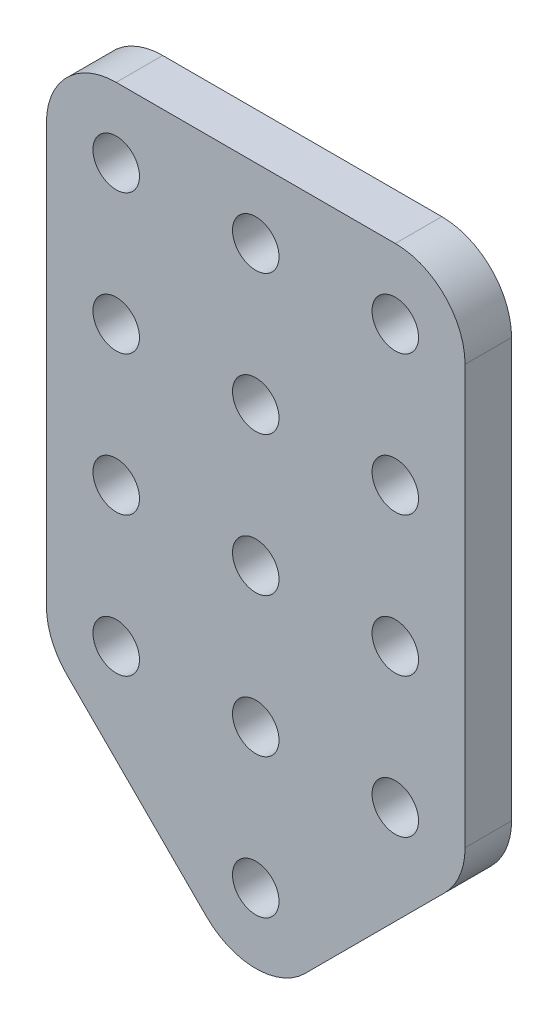
ISO-10303-21;
HEADER;
FILE_DESCRIPTION(('STEP AP214'),'2;1');
FILE_NAME('part.step','',(''),(''),'','','');
FILE_SCHEMA(('AUTOMOTIVE_DESIGN { 1 0 10303 214 1 1 1 1 }'));
ENDSEC;
DATA;
#1=APPLICATION_CONTEXT('core data for automotive mechanical design processes');
#2=APPLICATION_PROTOCOL_DEFINITION('international standard','automotive_design',2000,#1);
#3=PRODUCT_CONTEXT('',#1,'mechanical');
#4=PRODUCT('Part','Part','',(#3));
#5=PRODUCT_RELATED_PRODUCT_CATEGORY('part','',(#4));
#6=PRODUCT_DEFINITION_FORMATION('','',#4);
#7=PRODUCT_DEFINITION_CONTEXT('part definition',#1,'design');
#8=PRODUCT_DEFINITION('design','',#6,#7);
#9=PRODUCT_DEFINITION_SHAPE('','',#8);
#10=(LENGTH_UNIT() NAMED_UNIT(*) SI_UNIT(.MILLI.,.METRE.));
#11=(NAMED_UNIT(*) PLANE_ANGLE_UNIT() SI_UNIT($,.RADIAN.));
#12=(NAMED_UNIT(*) SI_UNIT($,.STERADIAN.) SOLID_ANGLE_UNIT());
#13=UNCERTAINTY_MEASURE_WITH_UNIT(LENGTH_MEASURE(1.E-05),#10,'distance_accuracy_value','');
#14=(GEOMETRIC_REPRESENTATION_CONTEXT(3) GLOBAL_UNCERTAINTY_ASSIGNED_CONTEXT((#13)) GLOBAL_UNIT_ASSIGNED_CONTEXT((#10,
#11,#12)) REPRESENTATION_CONTEXT('',''));
#15=CARTESIAN_POINT('',(0.,0.,0.));
#16=DIRECTION('',(0.,0.,1.));
#17=DIRECTION('',(1.,0.,0.));
#18=AXIS2_PLACEMENT_3D('',#15,#16,#17);
#19=CARTESIAN_POINT('',(187.7270545748,195.1787200631,3.));
#20=DIRECTION('',(0.,0.,1.));
#21=DIRECTION('',(1.,0.,0.));
#22=AXIS2_PLACEMENT_3D('',#19,#20,#21);
#23=PLANE('',#22);
#24=CARTESIAN_POINT('',(178.7270545748,231.1787200631,3.));
#25=DIRECTION('',(0.,0.,1.));
#26=DIRECTION('',(1.,0.,0.));
#27=AXIS2_PLACEMENT_3D('',#24,#25,#26);
#28=CIRCLE('',#27,1.5);
#29=CARTESIAN_POINT('',(180.2270545748,231.1787200631,3.));
#30=VERTEX_POINT('',#29);
#31=EDGE_CURVE('E271',#30,#30,#28,.T.);
#32=ORIENTED_EDGE('',*,*,#31,.F.);
#33=EDGE_LOOP('',(#32));
#34=FACE_BOUND('',#33,.T.);
#35=CARTESIAN_POINT('',(196.7270545748,222.1787200631,3.));
#36=DIRECTION('',(0.,0.,1.));
#37=DIRECTION('',(1.,0.,0.));
#38=AXIS2_PLACEMENT_3D('',#35,#36,#37);
#39=CIRCLE('',#38,1.5);
#40=CARTESIAN_POINT('',(198.2270545748,222.1787200631,3.));
#41=VERTEX_POINT('',#40);
#42=EDGE_CURVE('E259',#41,#41,#39,.T.);
#43=ORIENTED_EDGE('',*,*,#42,.F.);
#44=EDGE_LOOP('',(#43));
#45=FACE_BOUND('',#44,.T.);
#46=CARTESIAN_POINT('',(187.7270545748,222.1787200631,3.));
#47=DIRECTION('',(0.,0.,1.));
#48=DIRECTION('',(1.,0.,0.));
#49=AXIS2_PLACEMENT_3D('',#46,#47,#48);
#50=CIRCLE('',#49,1.5);
#51=CARTESIAN_POINT('',(189.2270545748,222.1787200631,3.));
#52=VERTEX_POINT('',#51);
#53=EDGE_CURVE('E247',#52,#52,#50,.T.);
#54=ORIENTED_EDGE('',*,*,#53,.F.);
#55=EDGE_LOOP('',(#54));
#56=FACE_BOUND('',#55,.T.);
#57=CARTESIAN_POINT('',(187.7270545748,195.1787200631,3.));
#58=DIRECTION('',(0.,0.,1.));
#59=DIRECTION('',(1.,0.,0.));
#60=AXIS2_PLACEMENT_3D('',#57,#58,#59);
#61=CIRCLE('',#60,1.5);
#62=CARTESIAN_POINT('',(189.2270545748,195.1787200631,3.));
#63=VERTEX_POINT('',#62);
#64=EDGE_CURVE('E235',#63,#63,#61,.T.);
#65=ORIENTED_EDGE('',*,*,#64,.F.);
#66=EDGE_LOOP('',(#65));
#67=FACE_BOUND('',#66,.T.);
#68=CARTESIAN_POINT('',(178.7270545748,213.1787200631,3.));
#69=DIRECTION('',(0.,0.,1.));
#70=DIRECTION('',(1.,0.,0.));
#71=AXIS2_PLACEMENT_3D('',#68,#69,#70);
#72=CIRCLE('',#71,1.5);
#73=CARTESIAN_POINT('',(180.2270545748,213.1787200631,3.));
#74=VERTEX_POINT('',#73);
#75=EDGE_CURVE('E223',#74,#74,#72,.T.);
#76=ORIENTED_EDGE('',*,*,#75,.F.);
#77=EDGE_LOOP('',(#76));
#78=FACE_BOUND('',#77,.T.);
#79=CARTESIAN_POINT('',(178.7270545748,204.1787200631,3.));
#80=DIRECTION('',(0.,0.,1.));
#81=DIRECTION('',(1.,0.,0.));
#82=AXIS2_PLACEMENT_3D('',#79,#80,#81);
#83=CIRCLE('',#82,1.5);
#84=CARTESIAN_POINT('',(180.2270545748,204.1787200631,3.));
#85=VERTEX_POINT('',#84);
#86=EDGE_CURVE('E211',#85,#85,#83,.T.);
#87=ORIENTED_EDGE('',*,*,#86,.F.);
#88=EDGE_LOOP('',(#87));
#89=FACE_BOUND('',#88,.T.);
#90=CARTESIAN_POINT('',(187.7270545748,195.1787200631,3.));
#91=DIRECTION('',(0.,0.,1.));
#92=DIRECTION('',(1.,0.,0.));
#93=AXIS2_PLACEMENT_3D('',#90,#91,#92);
#94=CIRCLE('',#93,4.50000000005025);
#95=CARTESIAN_POINT('',(184.5450740594,191.9967395477,3.));
#96=VERTEX_POINT('',#95);
#97=CARTESIAN_POINT('',(190.9090350901,191.9967395477,3.));
#98=VERTEX_POINT('',#97);
#99=EDGE_CURVE('E160',#96,#98,#94,.T.);
#100=ORIENTED_EDGE('',*,*,#99,.T.);
#101=DIRECTION('',(0.707106781186548,0.707106781186548,0.));
#102=VECTOR('',#101,1.);
#103=CARTESIAN_POINT('',(190.9090350901,191.9967395477,3.));
#104=LINE('',#103,#102);
#105=CARTESIAN_POINT('',(199.909035090095,200.996739547705,3.));
#106=VERTEX_POINT('',#105);
#107=EDGE_CURVE('E98',#98,#106,#104,.T.);
#108=ORIENTED_EDGE('',*,*,#107,.T.);
#109=CARTESIAN_POINT('',(196.7270545748,204.1787200631,3.));
#110=DIRECTION('',(0.,0.,1.));
#111=DIRECTION('',(1.,0.,0.));
#112=AXIS2_PLACEMENT_3D('',#109,#110,#111);
#113=CIRCLE('',#112,4.50000000000745);
#114=CARTESIAN_POINT('',(201.2270545748,204.1787200631,3.));
#115=VERTEX_POINT('',#114);
#116=EDGE_CURVE('E181',#106,#115,#113,.T.);
#117=ORIENTED_EDGE('',*,*,#116,.T.);
#118=DIRECTION('',(0.,1.,0.));
#119=VECTOR('',#118,1.);
#120=CARTESIAN_POINT('',(201.2270545748,231.1787200631,3.));
#121=LINE('',#120,#119);
#122=CARTESIAN_POINT('',(201.2270545748,231.1787200631,3.));
#123=VERTEX_POINT('',#122);
#124=EDGE_CURVE('E200',#115,#123,#121,.T.);
#125=ORIENTED_EDGE('',*,*,#124,.T.);
#126=CARTESIAN_POINT('',(196.7270545748,231.1787200631,3.));
#127=DIRECTION('',(0.,0.,1.));
#128=DIRECTION('',(1.,0.,0.));
#129=AXIS2_PLACEMENT_3D('',#126,#127,#128);
#130=CIRCLE('',#129,4.5);
#131=CARTESIAN_POINT('',(196.7270545748,235.6787200631,3.));
#132=VERTEX_POINT('',#131);
#133=EDGE_CURVE('E197',#123,#132,#130,.T.);
#134=ORIENTED_EDGE('',*,*,#133,.T.);
#135=DIRECTION('',(-1.,0.,0.));
#136=VECTOR('',#135,1.);
#137=CARTESIAN_POINT('',(196.7270545748,235.6787200631,3.));
#138=LINE('',#137,#136);
#139=CARTESIAN_POINT('',(178.7270545748,235.6787200631,3.));
#140=VERTEX_POINT('',#139);
#141=EDGE_CURVE('E199',#132,#140,#138,.T.);
#142=ORIENTED_EDGE('',*,*,#141,.T.);
#143=CARTESIAN_POINT('',(178.7270545748,231.1787200631,3.));
#144=DIRECTION('',(0.,0.,1.));
#145=DIRECTION('',(1.,0.,0.));
#146=AXIS2_PLACEMENT_3D('',#143,#144,#145);
#147=CIRCLE('',#146,4.5);
#148=CARTESIAN_POINT('',(174.2270545748,231.1787200631,3.));
#149=VERTEX_POINT('',#148);
#150=EDGE_CURVE('E123',#140,#149,#147,.T.);
#151=ORIENTED_EDGE('',*,*,#150,.T.);
#152=DIRECTION('',(0.,-1.,0.));
#153=VECTOR('',#152,1.);
#154=CARTESIAN_POINT('',(174.2270545748,213.1787200631,3.));
#155=LINE('',#154,#153);
#156=CARTESIAN_POINT('',(174.227054574757,204.1787200631,3.));
#157=VERTEX_POINT('',#156);
#158=EDGE_CURVE('E117',#149,#157,#155,.T.);
#159=ORIENTED_EDGE('',*,*,#158,.T.);
#160=CARTESIAN_POINT('',(178.7270545748,204.1787200631,3.));
#161=DIRECTION('',(0.,0.,1.));
#162=DIRECTION('',(1.,0.,0.));
#163=AXIS2_PLACEMENT_3D('',#160,#161,#162);
#164=CIRCLE('',#163,4.50000000004281);
#165=CARTESIAN_POINT('',(175.5450740594,200.9967395477,3.));
#166=VERTEX_POINT('',#165);
#167=EDGE_CURVE('E121',#157,#166,#164,.T.);
#168=ORIENTED_EDGE('',*,*,#167,.T.);
#169=DIRECTION('',(0.707106781186548,-0.707106781186548,0.));
#170=VECTOR('',#169,1.);
#171=CARTESIAN_POINT('',(184.5450740594,191.9967395477,3.));
#172=LINE('',#171,#170);
#173=EDGE_CURVE('E49',#166,#96,#172,.T.);
#174=ORIENTED_EDGE('',*,*,#173,.T.);
#175=EDGE_LOOP('',(#100,#108,#117,#125,#134,#142,#151,#159,#168,#174));
#176=FACE_BOUND('',#175,.T.);
#177=CARTESIAN_POINT('',(187.7270545748,204.1787200631,3.));
#178=DIRECTION('',(0.,0.,1.));
#179=DIRECTION('',(1.,0.,0.));
#180=AXIS2_PLACEMENT_3D('',#177,#178,#179);
#181=CIRCLE('',#180,1.5);
#182=CARTESIAN_POINT('',(189.2270545748,204.1787200631,3.));
#183=VERTEX_POINT('',#182);
#184=EDGE_CURVE('E144',#183,#183,#181,.T.);
#185=ORIENTED_EDGE('',*,*,#184,.F.);
#186=EDGE_LOOP('',(#185));
#187=FACE_BOUND('',#186,.T.);
#188=CARTESIAN_POINT('',(187.7270545748,213.1787200631,3.));
#189=DIRECTION('',(0.,0.,1.));
#190=DIRECTION('',(1.,0.,0.));
#191=AXIS2_PLACEMENT_3D('',#188,#189,#190);
#192=CIRCLE('',#191,1.5);
#193=CARTESIAN_POINT('',(189.2270545748,213.1787200631,3.));
#194=VERTEX_POINT('',#193);
#195=EDGE_CURVE('E217',#194,#194,#192,.T.);
#196=ORIENTED_EDGE('',*,*,#195,.F.);
#197=EDGE_LOOP('',(#196));
#198=FACE_BOUND('',#197,.T.);
#199=CARTESIAN_POINT('',(196.7270545748,213.1787200631,3.));
#200=DIRECTION('',(0.,0.,1.));
#201=DIRECTION('',(1.,0.,0.));
#202=AXIS2_PLACEMENT_3D('',#199,#200,#201);
#203=CIRCLE('',#202,1.5);
#204=CARTESIAN_POINT('',(198.2270545748,213.1787200631,3.));
#205=VERTEX_POINT('',#204);
#206=EDGE_CURVE('E229',#205,#205,#203,.T.);
#207=ORIENTED_EDGE('',*,*,#206,.F.);
#208=EDGE_LOOP('',(#207));
#209=FACE_BOUND('',#208,.T.);
#210=CARTESIAN_POINT('',(196.7270545748,204.1787200631,3.));
#211=DIRECTION('',(0.,0.,1.));
#212=DIRECTION('',(1.,0.,0.));
#213=AXIS2_PLACEMENT_3D('',#210,#211,#212);
#214=CIRCLE('',#213,1.5);
#215=CARTESIAN_POINT('',(198.2270545748,204.1787200631,3.));
#216=VERTEX_POINT('',#215);
#217=EDGE_CURVE('E241',#216,#216,#214,.T.);
#218=ORIENTED_EDGE('',*,*,#217,.F.);
#219=EDGE_LOOP('',(#218));
#220=FACE_BOUND('',#219,.T.);
#221=CARTESIAN_POINT('',(178.7270545748,222.1787200631,3.));
#222=DIRECTION('',(0.,0.,1.));
#223=DIRECTION('',(1.,0.,0.));
#224=AXIS2_PLACEMENT_3D('',#221,#222,#223);
#225=CIRCLE('',#224,1.5);
#226=CARTESIAN_POINT('',(180.2270545748,222.1787200631,3.));
#227=VERTEX_POINT('',#226);
#228=EDGE_CURVE('E253',#227,#227,#225,.T.);
#229=ORIENTED_EDGE('',*,*,#228,.F.);
#230=EDGE_LOOP('',(#229));
#231=FACE_BOUND('',#230,.T.);
#232=CARTESIAN_POINT('',(187.7270545748,231.1787200631,3.));
#233=DIRECTION('',(0.,0.,1.));
#234=DIRECTION('',(1.,0.,0.));
#235=AXIS2_PLACEMENT_3D('',#232,#233,#234);
#236=CIRCLE('',#235,1.5);
#237=CARTESIAN_POINT('',(189.2270545748,231.1787200631,3.));
#238=VERTEX_POINT('',#237);
#239=EDGE_CURVE('E265',#238,#238,#236,.T.);
#240=ORIENTED_EDGE('',*,*,#239,.F.);
#241=EDGE_LOOP('',(#240));
#242=FACE_BOUND('',#241,.T.);
#243=CARTESIAN_POINT('',(196.7270545748,231.1787200631,3.));
#244=DIRECTION('',(0.,0.,1.));
#245=DIRECTION('',(1.,0.,0.));
#246=AXIS2_PLACEMENT_3D('',#243,#244,#245);
#247=CIRCLE('',#246,1.5);
#248=CARTESIAN_POINT('',(198.2270545748,231.1787200631,3.));
#249=VERTEX_POINT('',#248);
#250=EDGE_CURVE('E277',#249,#249,#247,.T.);
#251=ORIENTED_EDGE('',*,*,#250,.F.);
#252=EDGE_LOOP('',(#251));
#253=FACE_BOUND('',#252,.T.);
#254=ADVANCED_FACE('F32',(#34,#45,#56,#67,#78,#89,#176,#187,#198,#209,#220,#231,#242,#253),#23,.T.);
#255=CARTESIAN_POINT('',(187.7270545748,195.1787200631,0.));
#256=DIRECTION('',(0.,0.,1.));
#257=DIRECTION('',(1.,0.,0.));
#258=AXIS2_PLACEMENT_3D('',#255,#256,#257);
#259=PLANE('',#258);
#260=CARTESIAN_POINT('',(178.7270545748,231.1787200631,0.));
#261=DIRECTION('',(0.,0.,1.));
#262=DIRECTION('',(1.,0.,0.));
#263=AXIS2_PLACEMENT_3D('',#260,#261,#262);
#264=CIRCLE('',#263,1.5);
#265=CARTESIAN_POINT('',(180.2270545748,231.1787200631,0.));
#266=VERTEX_POINT('',#265);
#267=EDGE_CURVE('E274',#266,#266,#264,.T.);
#268=ORIENTED_EDGE('',*,*,#267,.T.);
#269=EDGE_LOOP('',(#268));
#270=FACE_BOUND('',#269,.T.);
#271=CARTESIAN_POINT('',(196.7270545748,222.1787200631,0.));
#272=DIRECTION('',(0.,0.,1.));
#273=DIRECTION('',(1.,0.,0.));
#274=AXIS2_PLACEMENT_3D('',#271,#272,#273);
#275=CIRCLE('',#274,1.5);
#276=CARTESIAN_POINT('',(198.2270545748,222.1787200631,0.));
#277=VERTEX_POINT('',#276);
#278=EDGE_CURVE('E262',#277,#277,#275,.T.);
#279=ORIENTED_EDGE('',*,*,#278,.T.);
#280=EDGE_LOOP('',(#279));
#281=FACE_BOUND('',#280,.T.);
#282=CARTESIAN_POINT('',(187.7270545748,222.1787200631,0.));
#283=DIRECTION('',(0.,0.,1.));
#284=DIRECTION('',(1.,0.,0.));
#285=AXIS2_PLACEMENT_3D('',#282,#283,#284);
#286=CIRCLE('',#285,1.5);
#287=CARTESIAN_POINT('',(189.2270545748,222.1787200631,0.));
#288=VERTEX_POINT('',#287);
#289=EDGE_CURVE('E250',#288,#288,#286,.T.);
#290=ORIENTED_EDGE('',*,*,#289,.T.);
#291=EDGE_LOOP('',(#290));
#292=FACE_BOUND('',#291,.T.);
#293=CARTESIAN_POINT('',(187.7270545748,195.1787200631,0.));
#294=DIRECTION('',(0.,0.,1.));
#295=DIRECTION('',(1.,0.,0.));
#296=AXIS2_PLACEMENT_3D('',#293,#294,#295);
#297=CIRCLE('',#296,1.5);
#298=CARTESIAN_POINT('',(189.2270545748,195.1787200631,0.));
#299=VERTEX_POINT('',#298);
#300=EDGE_CURVE('E238',#299,#299,#297,.T.);
#301=ORIENTED_EDGE('',*,*,#300,.T.);
#302=EDGE_LOOP('',(#301));
#303=FACE_BOUND('',#302,.T.);
#304=CARTESIAN_POINT('',(178.7270545748,213.1787200631,0.));
#305=DIRECTION('',(0.,0.,1.));
#306=DIRECTION('',(1.,0.,0.));
#307=AXIS2_PLACEMENT_3D('',#304,#305,#306);
#308=CIRCLE('',#307,1.5);
#309=CARTESIAN_POINT('',(180.2270545748,213.1787200631,0.));
#310=VERTEX_POINT('',#309);
#311=EDGE_CURVE('E226',#310,#310,#308,.T.);
#312=ORIENTED_EDGE('',*,*,#311,.T.);
#313=EDGE_LOOP('',(#312));
#314=FACE_BOUND('',#313,.T.);
#315=CARTESIAN_POINT('',(178.7270545748,204.1787200631,0.));
#316=DIRECTION('',(0.,0.,1.));
#317=DIRECTION('',(1.,0.,0.));
#318=AXIS2_PLACEMENT_3D('',#315,#316,#317);
#319=CIRCLE('',#318,1.5);
#320=CARTESIAN_POINT('',(180.2270545748,204.1787200631,0.));
#321=VERTEX_POINT('',#320);
#322=EDGE_CURVE('E214',#321,#321,#319,.T.);
#323=ORIENTED_EDGE('',*,*,#322,.T.);
#324=EDGE_LOOP('',(#323));
#325=FACE_BOUND('',#324,.T.);
#326=CARTESIAN_POINT('',(187.7270545748,195.1787200631,0.));
#327=DIRECTION('',(0.,0.,1.));
#328=DIRECTION('',(1.,0.,0.));
#329=AXIS2_PLACEMENT_3D('',#326,#327,#328);
#330=CIRCLE('',#329,4.50000000005025);
#331=CARTESIAN_POINT('',(184.5450740594,191.9967395477,0.));
#332=VERTEX_POINT('',#331);
#333=CARTESIAN_POINT('',(190.9090350901,191.9967395477,0.));
#334=VERTEX_POINT('',#333);
#335=EDGE_CURVE('E140',#332,#334,#330,.T.);
#336=ORIENTED_EDGE('',*,*,#335,.F.);
#337=DIRECTION('',(0.707106781186548,-0.707106781186548,0.));
#338=VECTOR('',#337,1.);
#339=CARTESIAN_POINT('',(184.5450740594,191.9967395477,0.));
#340=LINE('',#339,#338);
#341=CARTESIAN_POINT('',(175.5450740594,200.9967395477,0.));
#342=VERTEX_POINT('',#341);
#343=EDGE_CURVE('E90',#342,#332,#340,.T.);
#344=ORIENTED_EDGE('',*,*,#343,.F.);
#345=CARTESIAN_POINT('',(178.7270545748,204.1787200631,0.));
#346=DIRECTION('',(0.,0.,1.));
#347=DIRECTION('',(1.,0.,0.));
#348=AXIS2_PLACEMENT_3D('',#345,#346,#347);
#349=CIRCLE('',#348,4.50000000004281);
#350=CARTESIAN_POINT('',(174.227054574757,204.1787200631,0.));
#351=VERTEX_POINT('',#350);
#352=EDGE_CURVE('E84',#351,#342,#349,.T.);
#353=ORIENTED_EDGE('',*,*,#352,.F.);
#354=DIRECTION('',(0.,-1.,0.));
#355=VECTOR('',#354,1.);
#356=CARTESIAN_POINT('',(174.2270545748,213.1787200631,0.));
#357=LINE('',#356,#355);
#358=CARTESIAN_POINT('',(174.2270545748,231.1787200631,0.));
#359=VERTEX_POINT('',#358);
#360=EDGE_CURVE('E130',#359,#351,#357,.T.);
#361=ORIENTED_EDGE('',*,*,#360,.F.);
#362=CARTESIAN_POINT('',(178.7270545748,231.1787200631,0.));
#363=DIRECTION('',(0.,0.,1.));
#364=DIRECTION('',(1.,0.,0.));
#365=AXIS2_PLACEMENT_3D('',#362,#363,#364);
#366=CIRCLE('',#365,4.5);
#367=CARTESIAN_POINT('',(178.7270545748,235.6787200631,0.));
#368=VERTEX_POINT('',#367);
#369=EDGE_CURVE('E154',#368,#359,#366,.T.);
#370=ORIENTED_EDGE('',*,*,#369,.F.);
#371=DIRECTION('',(-1.,0.,0.));
#372=VECTOR('',#371,1.);
#373=CARTESIAN_POINT('',(196.7270545748,235.6787200631,0.));
#374=LINE('',#373,#372);
#375=CARTESIAN_POINT('',(196.7270545748,235.6787200631,0.));
#376=VERTEX_POINT('',#375);
#377=EDGE_CURVE('E152',#376,#368,#374,.T.);
#378=ORIENTED_EDGE('',*,*,#377,.F.);
#379=CARTESIAN_POINT('',(196.7270545748,231.1787200631,0.));
#380=DIRECTION('',(0.,0.,1.));
#381=DIRECTION('',(1.,0.,0.));
#382=AXIS2_PLACEMENT_3D('',#379,#380,#381);
#383=CIRCLE('',#382,4.5);
#384=CARTESIAN_POINT('',(201.2270545748,231.1787200631,0.));
#385=VERTEX_POINT('',#384);
#386=EDGE_CURVE('E150',#385,#376,#383,.T.);
#387=ORIENTED_EDGE('',*,*,#386,.F.);
#388=DIRECTION('',(0.,1.,0.));
#389=VECTOR('',#388,1.);
#390=CARTESIAN_POINT('',(201.2270545748,231.1787200631,0.));
#391=LINE('',#390,#389);
#392=CARTESIAN_POINT('',(201.2270545748,204.1787200631,0.));
#393=VERTEX_POINT('',#392);
#394=EDGE_CURVE('E148',#393,#385,#391,.T.);
#395=ORIENTED_EDGE('',*,*,#394,.F.);
#396=CARTESIAN_POINT('',(196.7270545748,204.1787200631,0.));
#397=DIRECTION('',(0.,0.,1.));
#398=DIRECTION('',(1.,0.,0.));
#399=AXIS2_PLACEMENT_3D('',#396,#397,#398);
#400=CIRCLE('',#399,4.50000000000745);
#401=CARTESIAN_POINT('',(199.909035090095,200.996739547705,0.));
#402=VERTEX_POINT('',#401);
#403=EDGE_CURVE('E146',#402,#393,#400,.T.);
#404=ORIENTED_EDGE('',*,*,#403,.F.);
#405=DIRECTION('',(0.707106781186548,0.707106781186548,0.));
#406=VECTOR('',#405,1.);
#407=CARTESIAN_POINT('',(190.9090350901,191.9967395477,0.));
#408=LINE('',#407,#406);
#409=EDGE_CURVE('E143',#334,#402,#408,.T.);
#410=ORIENTED_EDGE('',*,*,#409,.F.);
#411=EDGE_LOOP('',(#336,#344,#353,#361,#370,#378,#387,#395,#404,#410));
#412=FACE_BOUND('',#411,.T.);
#413=CARTESIAN_POINT('',(187.7270545748,204.1787200631,0.));
#414=DIRECTION('',(0.,0.,1.));
#415=DIRECTION('',(1.,0.,0.));
#416=AXIS2_PLACEMENT_3D('',#413,#414,#415);
#417=CIRCLE('',#416,1.5);
#418=CARTESIAN_POINT('',(189.2270545748,204.1787200631,0.));
#419=VERTEX_POINT('',#418);
#420=EDGE_CURVE('E208',#419,#419,#417,.T.);
#421=ORIENTED_EDGE('',*,*,#420,.T.);
#422=EDGE_LOOP('',(#421));
#423=FACE_BOUND('',#422,.T.);
#424=CARTESIAN_POINT('',(187.7270545748,213.1787200631,0.));
#425=DIRECTION('',(0.,0.,1.));
#426=DIRECTION('',(1.,0.,0.));
#427=AXIS2_PLACEMENT_3D('',#424,#425,#426);
#428=CIRCLE('',#427,1.5);
#429=CARTESIAN_POINT('',(189.2270545748,213.1787200631,0.));
#430=VERTEX_POINT('',#429);
#431=EDGE_CURVE('E220',#430,#430,#428,.T.);
#432=ORIENTED_EDGE('',*,*,#431,.T.);
#433=EDGE_LOOP('',(#432));
#434=FACE_BOUND('',#433,.T.);
#435=CARTESIAN_POINT('',(196.7270545748,213.1787200631,0.));
#436=DIRECTION('',(0.,0.,1.));
#437=DIRECTION('',(1.,0.,0.));
#438=AXIS2_PLACEMENT_3D('',#435,#436,#437);
#439=CIRCLE('',#438,1.5);
#440=CARTESIAN_POINT('',(198.2270545748,213.1787200631,0.));
#441=VERTEX_POINT('',#440);
#442=EDGE_CURVE('E232',#441,#441,#439,.T.);
#443=ORIENTED_EDGE('',*,*,#442,.T.);
#444=EDGE_LOOP('',(#443));
#445=FACE_BOUND('',#444,.T.);
#446=CARTESIAN_POINT('',(196.7270545748,204.1787200631,0.));
#447=DIRECTION('',(0.,0.,1.));
#448=DIRECTION('',(1.,0.,0.));
#449=AXIS2_PLACEMENT_3D('',#446,#447,#448);
#450=CIRCLE('',#449,1.5);
#451=CARTESIAN_POINT('',(198.2270545748,204.1787200631,0.));
#452=VERTEX_POINT('',#451);
#453=EDGE_CURVE('E244',#452,#452,#450,.T.);
#454=ORIENTED_EDGE('',*,*,#453,.T.);
#455=EDGE_LOOP('',(#454));
#456=FACE_BOUND('',#455,.T.);
#457=CARTESIAN_POINT('',(178.7270545748,222.1787200631,0.));
#458=DIRECTION('',(0.,0.,1.));
#459=DIRECTION('',(1.,0.,0.));
#460=AXIS2_PLACEMENT_3D('',#457,#458,#459);
#461=CIRCLE('',#460,1.5);
#462=CARTESIAN_POINT('',(180.2270545748,222.1787200631,0.));
#463=VERTEX_POINT('',#462);
#464=EDGE_CURVE('E256',#463,#463,#461,.T.);
#465=ORIENTED_EDGE('',*,*,#464,.T.);
#466=EDGE_LOOP('',(#465));
#467=FACE_BOUND('',#466,.T.);
#468=CARTESIAN_POINT('',(187.7270545748,231.1787200631,0.));
#469=DIRECTION('',(0.,0.,1.));
#470=DIRECTION('',(1.,0.,0.));
#471=AXIS2_PLACEMENT_3D('',#468,#469,#470);
#472=CIRCLE('',#471,1.5);
#473=CARTESIAN_POINT('',(189.2270545748,231.1787200631,0.));
#474=VERTEX_POINT('',#473);
#475=EDGE_CURVE('E268',#474,#474,#472,.T.);
#476=ORIENTED_EDGE('',*,*,#475,.T.);
#477=EDGE_LOOP('',(#476));
#478=FACE_BOUND('',#477,.T.);
#479=CARTESIAN_POINT('',(196.7270545748,231.1787200631,0.));
#480=DIRECTION('',(0.,0.,1.));
#481=DIRECTION('',(1.,0.,0.));
#482=AXIS2_PLACEMENT_3D('',#479,#480,#481);
#483=CIRCLE('',#482,1.5);
#484=CARTESIAN_POINT('',(198.2270545748,231.1787200631,0.));
#485=VERTEX_POINT('',#484);
#486=EDGE_CURVE('E280',#485,#485,#483,.T.);
#487=ORIENTED_EDGE('',*,*,#486,.T.);
#488=EDGE_LOOP('',(#487));
#489=FACE_BOUND('',#488,.T.);
#490=ADVANCED_FACE('F185',(#270,#281,#292,#303,#314,#325,#412,#423,#434,#445,#456,#467,#478,
#489),#259,.F.);
#491=CARTESIAN_POINT('',(187.7270545748,195.1787200631,3.));
#492=DIRECTION('',(0.,0.,-1.));
#493=DIRECTION('',(-1.,0.,0.));
#494=AXIS2_PLACEMENT_3D('',#491,#492,#493);
#495=CYLINDRICAL_SURFACE('',#494,4.50000000005025);
#496=ORIENTED_EDGE('',*,*,#335,.T.);
#497=DIRECTION('',(0.,0.,-1.));
#498=VECTOR('',#497,1.);
#499=CARTESIAN_POINT('',(190.9090350901,191.9967395477,3.));
#500=LINE('',#499,#498);
#501=EDGE_CURVE('E11',#98,#334,#500,.T.);
#502=ORIENTED_EDGE('',*,*,#501,.F.);
#503=ORIENTED_EDGE('',*,*,#99,.F.);
#504=DIRECTION('',(0.,0.,-1.));
#505=VECTOR('',#504,1.);
#506=CARTESIAN_POINT('',(184.5450740594,191.9967395477,3.));
#507=LINE('',#506,#505);
#508=EDGE_CURVE('E136',#96,#332,#507,.T.);
#509=ORIENTED_EDGE('',*,*,#508,.T.);
#510=EDGE_LOOP('',(#496,#502,#503,#509));
#511=FACE_BOUND('',#510,.T.);
#512=ADVANCED_FACE('F34',(#511),#495,.T.);
#513=CARTESIAN_POINT('',(190.9090350901,191.9967395477,3.));
#514=DIRECTION('',(-0.707106781186547,0.707106781186547,0.));
#515=DIRECTION('',(-0.707106781186548,-0.707106781186548,0.));
#516=AXIS2_PLACEMENT_3D('',#513,#514,#515);
#517=PLANE('',#516);
#518=ORIENTED_EDGE('',*,*,#409,.T.);
#519=DIRECTION('',(0.,0.,-1.));
#520=VECTOR('',#519,1.);
#521=CARTESIAN_POINT('',(199.909035090095,200.996739547705,3.));
#522=LINE('',#521,#520);
#523=EDGE_CURVE('E41',#106,#402,#522,.T.);
#524=ORIENTED_EDGE('',*,*,#523,.F.);
#525=ORIENTED_EDGE('',*,*,#107,.F.);
#526=ORIENTED_EDGE('',*,*,#501,.T.);
#527=EDGE_LOOP('',(#518,#524,#525,#526));
#528=FACE_BOUND('',#527,.T.);
#529=ADVANCED_FACE('F323',(#528),#517,.F.);
#530=CARTESIAN_POINT('',(196.7270545748,204.1787200631,3.));
#531=DIRECTION('',(0.,0.,-1.));
#532=DIRECTION('',(-1.,0.,0.));
#533=AXIS2_PLACEMENT_3D('',#530,#531,#532);
#534=CYLINDRICAL_SURFACE('',#533,4.50000000000745);
#535=ORIENTED_EDGE('',*,*,#403,.T.);
#536=DIRECTION('',(0.,0.,-1.));
#537=VECTOR('',#536,1.);
#538=CARTESIAN_POINT('',(201.2270545748,204.1787200631,3.));
#539=LINE('',#538,#537);
#540=EDGE_CURVE('E173',#115,#393,#539,.T.);
#541=ORIENTED_EDGE('',*,*,#540,.F.);
#542=ORIENTED_EDGE('',*,*,#116,.F.);
#543=ORIENTED_EDGE('',*,*,#523,.T.);
#544=EDGE_LOOP('',(#535,#541,#542,#543));
#545=FACE_BOUND('',#544,.T.);
#546=ADVANCED_FACE('F179',(#545),#534,.T.);
#547=CARTESIAN_POINT('',(201.2270545748,231.1787200631,3.));
#548=DIRECTION('',(-1.,0.,0.));
#549=DIRECTION('',(0.,0.,1.));
#550=AXIS2_PLACEMENT_3D('',#547,#548,#549);
#551=PLANE('',#550);
#552=ORIENTED_EDGE('',*,*,#394,.T.);
#553=DIRECTION('',(0.,0.,-1.));
#554=VECTOR('',#553,1.);
#555=CARTESIAN_POINT('',(201.2270545748,231.1787200631,3.));
#556=LINE('',#555,#554);
#557=EDGE_CURVE('E170',#123,#385,#556,.T.);
#558=ORIENTED_EDGE('',*,*,#557,.F.);
#559=ORIENTED_EDGE('',*,*,#124,.F.);
#560=ORIENTED_EDGE('',*,*,#540,.T.);
#561=EDGE_LOOP('',(#552,#558,#559,#560));
#562=FACE_BOUND('',#561,.T.);
#563=ADVANCED_FACE('F191',(#562),#551,.F.);
#564=CARTESIAN_POINT('',(196.7270545748,231.1787200631,3.));
#565=DIRECTION('',(0.,0.,-1.));
#566=DIRECTION('',(-1.,0.,0.));
#567=AXIS2_PLACEMENT_3D('',#564,#565,#566);
#568=CYLINDRICAL_SURFACE('',#567,4.5);
#569=ORIENTED_EDGE('',*,*,#386,.T.);
#570=DIRECTION('',(0.,0.,-1.));
#571=VECTOR('',#570,1.);
#572=CARTESIAN_POINT('',(196.7270545748,235.6787200631,3.));
#573=LINE('',#572,#571);
#574=EDGE_CURVE('E167',#132,#376,#573,.T.);
#575=ORIENTED_EDGE('',*,*,#574,.F.);
#576=ORIENTED_EDGE('',*,*,#133,.F.);
#577=ORIENTED_EDGE('',*,*,#557,.T.);
#578=EDGE_LOOP('',(#569,#575,#576,#577));
#579=FACE_BOUND('',#578,.T.);
#580=ADVANCED_FACE('F195',(#579),#568,.T.);
#581=CARTESIAN_POINT('',(196.7270545748,235.6787200631,3.));
#582=DIRECTION('',(0.,-1.,0.));
#583=DIRECTION('',(0.,0.,-1.));
#584=AXIS2_PLACEMENT_3D('',#581,#582,#583);
#585=PLANE('',#584);
#586=ORIENTED_EDGE('',*,*,#377,.T.);
#587=DIRECTION('',(0.,0.,-1.));
#588=VECTOR('',#587,1.);
#589=CARTESIAN_POINT('',(178.7270545748,235.6787200631,3.));
#590=LINE('',#589,#588);
#591=EDGE_CURVE('E164',#140,#368,#590,.T.);
#592=ORIENTED_EDGE('',*,*,#591,.F.);
#593=ORIENTED_EDGE('',*,*,#141,.F.);
#594=ORIENTED_EDGE('',*,*,#574,.T.);
#595=EDGE_LOOP('',(#586,#592,#593,#594));
#596=FACE_BOUND('',#595,.T.);
#597=ADVANCED_FACE('F313',(#596),#585,.F.);
#598=CARTESIAN_POINT('',(178.7270545748,231.1787200631,3.));
#599=DIRECTION('',(0.,0.,-1.));
#600=DIRECTION('',(-1.,0.,0.));
#601=AXIS2_PLACEMENT_3D('',#598,#599,#600);
#602=CYLINDRICAL_SURFACE('',#601,4.5);
#603=ORIENTED_EDGE('',*,*,#369,.T.);
#604=DIRECTION('',(0.,0.,-1.));
#605=VECTOR('',#604,1.);
#606=CARTESIAN_POINT('',(174.2270545748,231.1787200631,3.));
#607=LINE('',#606,#605);
#608=EDGE_CURVE('E131',#149,#359,#607,.T.);
#609=ORIENTED_EDGE('',*,*,#608,.F.);
#610=ORIENTED_EDGE('',*,*,#150,.F.);
#611=ORIENTED_EDGE('',*,*,#591,.T.);
#612=EDGE_LOOP('',(#603,#609,#610,#611));
#613=FACE_BOUND('',#612,.T.);
#614=ADVANCED_FACE('F310',(#613),#602,.T.);
#615=CARTESIAN_POINT('',(174.2270545748,213.1787200631,3.));
#616=DIRECTION('',(1.,0.,0.));
#617=DIRECTION('',(0.,0.,-1.));
#618=AXIS2_PLACEMENT_3D('',#615,#616,#617);
#619=PLANE('',#618);
#620=ORIENTED_EDGE('',*,*,#360,.T.);
#621=DIRECTION('',(0.,0.,-1.));
#622=VECTOR('',#621,1.);
#623=CARTESIAN_POINT('',(174.227054574757,204.1787200631,3.));
#624=LINE('',#623,#622);
#625=EDGE_CURVE('E128',#157,#351,#624,.T.);
#626=ORIENTED_EDGE('',*,*,#625,.F.);
#627=ORIENTED_EDGE('',*,*,#158,.F.);
#628=ORIENTED_EDGE('',*,*,#608,.T.);
#629=EDGE_LOOP('',(#620,#626,#627,#628));
#630=FACE_BOUND('',#629,.T.);
#631=ADVANCED_FACE('F129',(#630),#619,.F.);
#632=CARTESIAN_POINT('',(178.7270545748,204.1787200631,3.));
#633=DIRECTION('',(0.,0.,-1.));
#634=DIRECTION('',(-1.,0.,0.));
#635=AXIS2_PLACEMENT_3D('',#632,#633,#634);
#636=CYLINDRICAL_SURFACE('',#635,4.50000000004281);
#637=ORIENTED_EDGE('',*,*,#352,.T.);
#638=DIRECTION('',(0.,0.,-1.));
#639=VECTOR('',#638,1.);
#640=CARTESIAN_POINT('',(175.5450740594,200.9967395477,3.));
#641=LINE('',#640,#639);
#642=EDGE_CURVE('E132',#166,#342,#641,.T.);
#643=ORIENTED_EDGE('',*,*,#642,.F.);
#644=ORIENTED_EDGE('',*,*,#167,.F.);
#645=ORIENTED_EDGE('',*,*,#625,.T.);
#646=EDGE_LOOP('',(#637,#643,#644,#645));
#647=FACE_BOUND('',#646,.T.);
#648=ADVANCED_FACE('F134',(#647),#636,.T.);
#649=CARTESIAN_POINT('',(184.5450740594,191.9967395477,3.));
#650=DIRECTION('',(0.707106781186547,0.707106781186547,0.));
#651=DIRECTION('',(-0.707106781186548,0.707106781186548,0.));
#652=AXIS2_PLACEMENT_3D('',#649,#650,#651);
#653=PLANE('',#652);
#654=ORIENTED_EDGE('',*,*,#343,.T.);
#655=ORIENTED_EDGE('',*,*,#508,.F.);
#656=ORIENTED_EDGE('',*,*,#173,.F.);
#657=ORIENTED_EDGE('',*,*,#642,.T.);
#658=EDGE_LOOP('',(#654,#655,#656,#657));
#659=FACE_BOUND('',#658,.T.);
#660=ADVANCED_FACE('F303',(#659),#653,.F.);
#661=CARTESIAN_POINT('',(187.7270545748,204.1787200631,3.));
#662=DIRECTION('',(0.,0.,-1.));
#663=DIRECTION('',(-1.,0.,0.));
#664=AXIS2_PLACEMENT_3D('',#661,#662,#663);
#665=CYLINDRICAL_SURFACE('',#664,1.5);
#666=ORIENTED_EDGE('',*,*,#184,.T.);
#667=EDGE_LOOP('',(#666));
#668=FACE_BOUND('',#667,.T.);
#669=ORIENTED_EDGE('',*,*,#420,.F.);
#670=EDGE_LOOP('',(#669));
#671=FACE_BOUND('',#670,.T.);
#672=ADVANCED_FACE('F300',(#668,#671),#665,.F.);
#673=CARTESIAN_POINT('',(178.7270545748,204.1787200631,3.));
#674=DIRECTION('',(0.,0.,-1.));
#675=DIRECTION('',(-1.,0.,0.));
#676=AXIS2_PLACEMENT_3D('',#673,#674,#675);
#677=CYLINDRICAL_SURFACE('',#676,1.5);
#678=ORIENTED_EDGE('',*,*,#86,.T.);
#679=EDGE_LOOP('',(#678));
#680=FACE_BOUND('',#679,.T.);
#681=ORIENTED_EDGE('',*,*,#322,.F.);
#682=EDGE_LOOP('',(#681));
#683=FACE_BOUND('',#682,.T.);
#684=ADVANCED_FACE('F402',(#680,#683),#677,.F.);
#685=CARTESIAN_POINT('',(187.7270545748,213.1787200631,3.));
#686=DIRECTION('',(0.,0.,-1.));
#687=DIRECTION('',(-1.,0.,0.));
#688=AXIS2_PLACEMENT_3D('',#685,#686,#687);
#689=CYLINDRICAL_SURFACE('',#688,1.5);
#690=ORIENTED_EDGE('',*,*,#195,.T.);
#691=EDGE_LOOP('',(#690));
#692=FACE_BOUND('',#691,.T.);
#693=ORIENTED_EDGE('',*,*,#431,.F.);
#694=EDGE_LOOP('',(#693));
#695=FACE_BOUND('',#694,.T.);
#696=ADVANCED_FACE('F410',(#692,#695),#689,.F.);
#697=CARTESIAN_POINT('',(178.7270545748,213.1787200631,3.));
#698=DIRECTION('',(0.,0.,-1.));
#699=DIRECTION('',(-1.,0.,0.));
#700=AXIS2_PLACEMENT_3D('',#697,#698,#699);
#701=CYLINDRICAL_SURFACE('',#700,1.5);
#702=ORIENTED_EDGE('',*,*,#75,.T.);
#703=EDGE_LOOP('',(#702));
#704=FACE_BOUND('',#703,.T.);
#705=ORIENTED_EDGE('',*,*,#311,.F.);
#706=EDGE_LOOP('',(#705));
#707=FACE_BOUND('',#706,.T.);
#708=ADVANCED_FACE('F418',(#704,#707),#701,.F.);
#709=CARTESIAN_POINT('',(196.7270545748,213.1787200631,3.));
#710=DIRECTION('',(0.,0.,-1.));
#711=DIRECTION('',(-1.,0.,0.));
#712=AXIS2_PLACEMENT_3D('',#709,#710,#711);
#713=CYLINDRICAL_SURFACE('',#712,1.5);
#714=ORIENTED_EDGE('',*,*,#206,.T.);
#715=EDGE_LOOP('',(#714));
#716=FACE_BOUND('',#715,.T.);
#717=ORIENTED_EDGE('',*,*,#442,.F.);
#718=EDGE_LOOP('',(#717));
#719=FACE_BOUND('',#718,.T.);
#720=ADVANCED_FACE('F427',(#716,#719),#713,.F.);
#721=CARTESIAN_POINT('',(187.7270545748,195.1787200631,3.));
#722=DIRECTION('',(0.,0.,-1.));
#723=DIRECTION('',(-1.,0.,0.));
#724=AXIS2_PLACEMENT_3D('',#721,#722,#723);
#725=CYLINDRICAL_SURFACE('',#724,1.5);
#726=ORIENTED_EDGE('',*,*,#64,.T.);
#727=EDGE_LOOP('',(#726));
#728=FACE_BOUND('',#727,.T.);
#729=ORIENTED_EDGE('',*,*,#300,.F.);
#730=EDGE_LOOP('',(#729));
#731=FACE_BOUND('',#730,.T.);
#732=ADVANCED_FACE('F436',(#728,#731),#725,.F.);
#733=CARTESIAN_POINT('',(196.7270545748,204.1787200631,3.));
#734=DIRECTION('',(0.,0.,-1.));
#735=DIRECTION('',(-1.,0.,0.));
#736=AXIS2_PLACEMENT_3D('',#733,#734,#735);
#737=CYLINDRICAL_SURFACE('',#736,1.5);
#738=ORIENTED_EDGE('',*,*,#217,.T.);
#739=EDGE_LOOP('',(#738));
#740=FACE_BOUND('',#739,.T.);
#741=ORIENTED_EDGE('',*,*,#453,.F.);
#742=EDGE_LOOP('',(#741));
#743=FACE_BOUND('',#742,.T.);
#744=ADVANCED_FACE('F445',(#740,#743),#737,.F.);
#745=CARTESIAN_POINT('',(187.7270545748,222.1787200631,3.));
#746=DIRECTION('',(0.,0.,-1.));
#747=DIRECTION('',(-1.,0.,0.));
#748=AXIS2_PLACEMENT_3D('',#745,#746,#747);
#749=CYLINDRICAL_SURFACE('',#748,1.5);
#750=ORIENTED_EDGE('',*,*,#53,.T.);
#751=EDGE_LOOP('',(#750));
#752=FACE_BOUND('',#751,.T.);
#753=ORIENTED_EDGE('',*,*,#289,.F.);
#754=EDGE_LOOP('',(#753));
#755=FACE_BOUND('',#754,.T.);
#756=ADVANCED_FACE('F454',(#752,#755),#749,.F.);
#757=CARTESIAN_POINT('',(178.7270545748,222.1787200631,3.));
#758=DIRECTION('',(0.,0.,-1.));
#759=DIRECTION('',(-1.,0.,0.));
#760=AXIS2_PLACEMENT_3D('',#757,#758,#759);
#761=CYLINDRICAL_SURFACE('',#760,1.5);
#762=ORIENTED_EDGE('',*,*,#228,.T.);
#763=EDGE_LOOP('',(#762));
#764=FACE_BOUND('',#763,.T.);
#765=ORIENTED_EDGE('',*,*,#464,.F.);
#766=EDGE_LOOP('',(#765));
#767=FACE_BOUND('',#766,.T.);
#768=ADVANCED_FACE('F463',(#764,#767),#761,.F.);
#769=CARTESIAN_POINT('',(196.7270545748,222.1787200631,3.));
#770=DIRECTION('',(0.,0.,-1.));
#771=DIRECTION('',(-1.,0.,0.));
#772=AXIS2_PLACEMENT_3D('',#769,#770,#771);
#773=CYLINDRICAL_SURFACE('',#772,1.5);
#774=ORIENTED_EDGE('',*,*,#42,.T.);
#775=EDGE_LOOP('',(#774));
#776=FACE_BOUND('',#775,.T.);
#777=ORIENTED_EDGE('',*,*,#278,.F.);
#778=EDGE_LOOP('',(#777));
#779=FACE_BOUND('',#778,.T.);
#780=ADVANCED_FACE('F472',(#776,#779),#773,.F.);
#781=CARTESIAN_POINT('',(187.7270545748,231.1787200631,3.));
#782=DIRECTION('',(0.,0.,-1.));
#783=DIRECTION('',(-1.,0.,0.));
#784=AXIS2_PLACEMENT_3D('',#781,#782,#783);
#785=CYLINDRICAL_SURFACE('',#784,1.5);
#786=ORIENTED_EDGE('',*,*,#239,.T.);
#787=EDGE_LOOP('',(#786));
#788=FACE_BOUND('',#787,.T.);
#789=ORIENTED_EDGE('',*,*,#475,.F.);
#790=EDGE_LOOP('',(#789));
#791=FACE_BOUND('',#790,.T.);
#792=ADVANCED_FACE('F481',(#788,#791),#785,.F.);
#793=CARTESIAN_POINT('',(178.7270545748,231.1787200631,3.));
#794=DIRECTION('',(0.,0.,-1.));
#795=DIRECTION('',(-1.,0.,0.));
#796=AXIS2_PLACEMENT_3D('',#793,#794,#795);
#797=CYLINDRICAL_SURFACE('',#796,1.5);
#798=ORIENTED_EDGE('',*,*,#31,.T.);
#799=EDGE_LOOP('',(#798));
#800=FACE_BOUND('',#799,.T.);
#801=ORIENTED_EDGE('',*,*,#267,.F.);
#802=EDGE_LOOP('',(#801));
#803=FACE_BOUND('',#802,.T.);
#804=ADVANCED_FACE('F490',(#800,#803),#797,.F.);
#805=CARTESIAN_POINT('',(196.7270545748,231.1787200631,3.));
#806=DIRECTION('',(0.,0.,-1.));
#807=DIRECTION('',(-1.,0.,0.));
#808=AXIS2_PLACEMENT_3D('',#805,#806,#807);
#809=CYLINDRICAL_SURFACE('',#808,1.5);
#810=ORIENTED_EDGE('',*,*,#250,.T.);
#811=EDGE_LOOP('',(#810));
#812=FACE_BOUND('',#811,.T.);
#813=ORIENTED_EDGE('',*,*,#486,.F.);
#814=EDGE_LOOP('',(#813));
#815=FACE_BOUND('',#814,.T.);
#816=ADVANCED_FACE('F286',(#812,#815),#809,.F.);
#817=CLOSED_SHELL('',(#254,#490,#512,#529,#546,#563,#580,#597,#614,#631,#648,#660,#672,#684,
#696,#708,#720,#732,#744,#756,#768,#780,#792,#804,#816));
#818=MANIFOLD_SOLID_BREP('B2',#817);
#819=ADVANCED_BREP_SHAPE_REPRESENTATION('',(#18,#818),#14);
#820=SHAPE_DEFINITION_REPRESENTATION(#9,#819);
ENDSEC;
END-ISO-10303-21;
